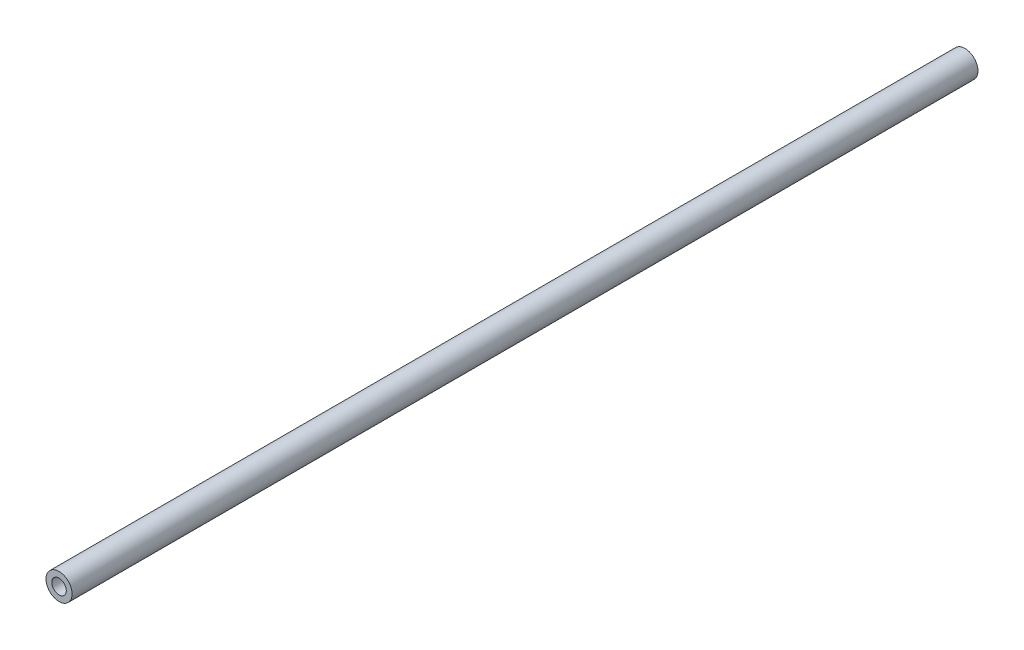
ISO-10303-21;
HEADER;
FILE_DESCRIPTION(('STEP AP214'),'2;1');
FILE_NAME('part.step','',(''),(''),'','','');
FILE_SCHEMA(('AUTOMOTIVE_DESIGN { 1 0 10303 214 1 1 1 1 }'));
ENDSEC;
DATA;
#1=APPLICATION_CONTEXT('core data for automotive mechanical design processes');
#2=APPLICATION_PROTOCOL_DEFINITION('international standard','automotive_design',2000,#1);
#3=PRODUCT_CONTEXT('',#1,'mechanical');
#4=PRODUCT('Part','Part','',(#3));
#5=PRODUCT_RELATED_PRODUCT_CATEGORY('part','',(#4));
#6=PRODUCT_DEFINITION_FORMATION('','',#4);
#7=PRODUCT_DEFINITION_CONTEXT('part definition',#1,'design');
#8=PRODUCT_DEFINITION('design','',#6,#7);
#9=PRODUCT_DEFINITION_SHAPE('','',#8);
#10=(LENGTH_UNIT() NAMED_UNIT(*) SI_UNIT(.MILLI.,.METRE.));
#11=(NAMED_UNIT(*) PLANE_ANGLE_UNIT() SI_UNIT($,.RADIAN.));
#12=(NAMED_UNIT(*) SI_UNIT($,.STERADIAN.) SOLID_ANGLE_UNIT());
#13=UNCERTAINTY_MEASURE_WITH_UNIT(LENGTH_MEASURE(1.E-05),#10,'distance_accuracy_value','');
#14=(GEOMETRIC_REPRESENTATION_CONTEXT(3) GLOBAL_UNCERTAINTY_ASSIGNED_CONTEXT((#13)) GLOBAL_UNIT_ASSIGNED_CONTEXT((#10,
#11,#12)) REPRESENTATION_CONTEXT('',''));
#15=CARTESIAN_POINT('',(0.,0.,0.));
#16=DIRECTION('',(0.,0.,1.));
#17=DIRECTION('',(1.,0.,0.));
#18=AXIS2_PLACEMENT_3D('',#15,#16,#17);
#19=CARTESIAN_POINT('',(0.,0.,593.65));
#20=DIRECTION('',(0.,0.,1.));
#21=DIRECTION('',(1.,0.,0.));
#22=AXIS2_PLACEMENT_3D('',#19,#20,#21);
#23=PLANE('',#22);
#24=CARTESIAN_POINT('',(0.,0.,593.65));
#25=DIRECTION('',(0.,0.,1.));
#26=DIRECTION('',(1.,0.,0.));
#27=AXIS2_PLACEMENT_3D('',#24,#25,#26);
#28=CIRCLE('',#27,8.55);
#29=CARTESIAN_POINT('',(8.55,0.,593.65));
#30=VERTEX_POINT('',#29);
#31=EDGE_CURVE('E10',#30,#30,#28,.T.);
#32=ORIENTED_EDGE('',*,*,#31,.T.);
#33=EDGE_LOOP('',(#32));
#34=FACE_BOUND('',#33,.T.);
#35=CARTESIAN_POINT('',(0.,0.,593.65));
#36=DIRECTION('',(0.,0.,1.));
#37=DIRECTION('',(1.,0.,0.));
#38=AXIS2_PLACEMENT_3D('',#35,#36,#37);
#39=CIRCLE('',#38,4.765);
#40=CARTESIAN_POINT('',(4.765,0.,593.65));
#41=VERTEX_POINT('',#40);
#42=EDGE_CURVE('E42',#41,#41,#39,.T.);
#43=ORIENTED_EDGE('',*,*,#42,.F.);
#44=EDGE_LOOP('',(#43));
#45=FACE_BOUND('',#44,.T.);
#46=ADVANCED_FACE('F31',(#34,#45),#23,.T.);
#47=CARTESIAN_POINT('',(0.,0.,0.));
#48=DIRECTION('',(0.,0.,1.));
#49=DIRECTION('',(1.,0.,0.));
#50=AXIS2_PLACEMENT_3D('',#47,#48,#49);
#51=PLANE('',#50);
#52=CARTESIAN_POINT('',(0.,0.,0.));
#53=DIRECTION('',(0.,0.,1.));
#54=DIRECTION('',(1.,0.,0.));
#55=AXIS2_PLACEMENT_3D('',#52,#53,#54);
#56=CIRCLE('',#55,8.55);
#57=CARTESIAN_POINT('',(8.55,0.,0.));
#58=VERTEX_POINT('',#57);
#59=EDGE_CURVE('E35',#58,#58,#56,.T.);
#60=ORIENTED_EDGE('',*,*,#59,.F.);
#61=EDGE_LOOP('',(#60));
#62=FACE_BOUND('',#61,.T.);
#63=CARTESIAN_POINT('',(0.,0.,0.));
#64=DIRECTION('',(0.,0.,1.));
#65=DIRECTION('',(1.,0.,0.));
#66=AXIS2_PLACEMENT_3D('',#63,#64,#65);
#67=CIRCLE('',#66,4.765);
#68=CARTESIAN_POINT('',(4.765,0.,0.));
#69=VERTEX_POINT('',#68);
#70=EDGE_CURVE('E44',#69,#69,#67,.T.);
#71=ORIENTED_EDGE('',*,*,#70,.T.);
#72=EDGE_LOOP('',(#71));
#73=FACE_BOUND('',#72,.T.);
#74=ADVANCED_FACE('F54',(#62,#73),#51,.F.);
#75=CARTESIAN_POINT('',(0.,0.,593.65));
#76=DIRECTION('',(0.,0.,-1.));
#77=DIRECTION('',(-1.,0.,0.));
#78=AXIS2_PLACEMENT_3D('',#75,#76,#77);
#79=CYLINDRICAL_SURFACE('',#78,8.55);
#80=ORIENTED_EDGE('',*,*,#31,.F.);
#81=EDGE_LOOP('',(#80));
#82=FACE_BOUND('',#81,.T.);
#83=ORIENTED_EDGE('',*,*,#59,.T.);
#84=EDGE_LOOP('',(#83));
#85=FACE_BOUND('',#84,.T.);
#86=ADVANCED_FACE('F33',(#82,#85),#79,.T.);
#87=CARTESIAN_POINT('',(0.,0.,593.65));
#88=DIRECTION('',(0.,0.,-1.));
#89=DIRECTION('',(-1.,0.,0.));
#90=AXIS2_PLACEMENT_3D('',#87,#88,#89);
#91=CYLINDRICAL_SURFACE('',#90,4.765);
#92=ORIENTED_EDGE('',*,*,#42,.T.);
#93=EDGE_LOOP('',(#92));
#94=FACE_BOUND('',#93,.T.);
#95=ORIENTED_EDGE('',*,*,#70,.F.);
#96=EDGE_LOOP('',(#95));
#97=FACE_BOUND('',#96,.T.);
#98=ADVANCED_FACE('F50',(#94,#97),#91,.F.);
#99=CLOSED_SHELL('',(#46,#74,#86,#98));
#100=MANIFOLD_SOLID_BREP('B2',#99);
#101=ADVANCED_BREP_SHAPE_REPRESENTATION('',(#18,#100),#14);
#102=SHAPE_DEFINITION_REPRESENTATION(#9,#101);
ENDSEC;
END-ISO-10303-21;
